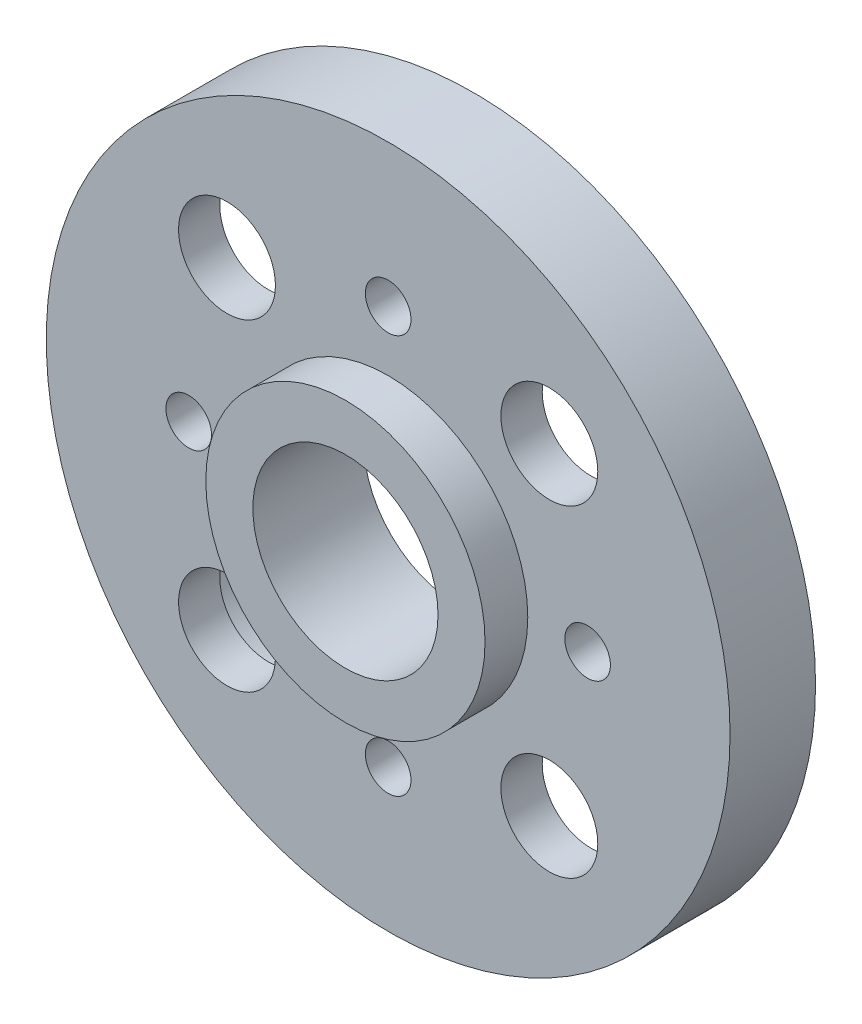
ISO-10303-21;
HEADER;
FILE_DESCRIPTION(('STEP AP214'),'2;1');
FILE_NAME('part.step','',(''),(''),'','','');
FILE_SCHEMA(('AUTOMOTIVE_DESIGN { 1 0 10303 214 1 1 1 1 }'));
ENDSEC;
DATA;
#1=APPLICATION_CONTEXT('core data for automotive mechanical design processes');
#2=APPLICATION_PROTOCOL_DEFINITION('international standard','automotive_design',2000,#1);
#3=PRODUCT_CONTEXT('',#1,'mechanical');
#4=PRODUCT('Part','Part','',(#3));
#5=PRODUCT_RELATED_PRODUCT_CATEGORY('part','',(#4));
#6=PRODUCT_DEFINITION_FORMATION('','',#4);
#7=PRODUCT_DEFINITION_CONTEXT('part definition',#1,'design');
#8=PRODUCT_DEFINITION('design','',#6,#7);
#9=PRODUCT_DEFINITION_SHAPE('','',#8);
#10=(LENGTH_UNIT() NAMED_UNIT(*) SI_UNIT(.MILLI.,.METRE.));
#11=(NAMED_UNIT(*) PLANE_ANGLE_UNIT() SI_UNIT($,.RADIAN.));
#12=(NAMED_UNIT(*) SI_UNIT($,.STERADIAN.) SOLID_ANGLE_UNIT());
#13=UNCERTAINTY_MEASURE_WITH_UNIT(LENGTH_MEASURE(1.E-05),#10,'distance_accuracy_value','');
#14=(GEOMETRIC_REPRESENTATION_CONTEXT(3) GLOBAL_UNCERTAINTY_ASSIGNED_CONTEXT((#13)) GLOBAL_UNIT_ASSIGNED_CONTEXT((#10,
#11,#12)) REPRESENTATION_CONTEXT('',''));
#15=CARTESIAN_POINT('',(0.,0.,0.));
#16=DIRECTION('',(0.,0.,1.));
#17=DIRECTION('',(1.,0.,0.));
#18=AXIS2_PLACEMENT_3D('',#15,#16,#17);
#19=CARTESIAN_POINT('',(0.,0.,0.));
#20=DIRECTION('',(0.,0.,1.));
#21=DIRECTION('',(1.,0.,0.));
#22=AXIS2_PLACEMENT_3D('',#19,#20,#21);
#23=PLANE('',#22);
#24=CARTESIAN_POINT('',(0.,0.,0.));
#25=DIRECTION('',(0.,0.,1.));
#26=DIRECTION('',(1.,0.,0.));
#27=AXIS2_PLACEMENT_3D('',#24,#25,#26);
#28=CIRCLE('',#27,12.);
#29=CARTESIAN_POINT('',(12.,0.,0.));
#30=VERTEX_POINT('',#29);
#31=EDGE_CURVE('E168',#30,#30,#28,.T.);
#32=ORIENTED_EDGE('',*,*,#31,.F.);
#33=EDGE_LOOP('',(#32));
#34=FACE_BOUND('',#33,.T.);
#35=CARTESIAN_POINT('',(5.65685424949238,5.65685424949238,0.));
#36=DIRECTION('',(0.,0.,-1.));
#37=DIRECTION('',(-1.,0.,0.));
#38=AXIS2_PLACEMENT_3D('',#35,#36,#37);
#39=CIRCLE('',#38,3.15);
#40=CARTESIAN_POINT('',(4.97507668163147,8.73218827166975,0.));
#41=VERTEX_POINT('',#40);
#42=CARTESIAN_POINT('',(8.73218827166975,4.97507668163147,0.));
#43=VERTEX_POINT('',#42);
#44=EDGE_CURVE('E134',#41,#43,#39,.T.);
#45=ORIENTED_EDGE('',*,*,#44,.F.);
#46=CARTESIAN_POINT('',(0.,0.,0.));
#47=DIRECTION('',(0.,0.,1.));
#48=DIRECTION('',(1.,0.,0.));
#49=AXIS2_PLACEMENT_3D('',#46,#47,#48);
#50=CIRCLE('',#49,10.05);
#51=CARTESIAN_POINT('',(-4.97507668163147,8.73218827166975,0.));
#52=VERTEX_POINT('',#51);
#53=EDGE_CURVE('E138',#41,#52,#50,.T.);
#54=ORIENTED_EDGE('',*,*,#53,.T.);
#55=CARTESIAN_POINT('',(-5.65685424949238,5.65685424949238,0.));
#56=DIRECTION('',(0.,0.,-1.));
#57=DIRECTION('',(-1.,0.,0.));
#58=AXIS2_PLACEMENT_3D('',#55,#56,#57);
#59=CIRCLE('',#58,3.15);
#60=CARTESIAN_POINT('',(-8.73218827166975,4.97507668163147,0.));
#61=VERTEX_POINT('',#60);
#62=EDGE_CURVE('E186',#61,#52,#59,.T.);
#63=ORIENTED_EDGE('',*,*,#62,.F.);
#64=CARTESIAN_POINT('',(-8.73218827166975,-4.97507668163147,0.));
#65=VERTEX_POINT('',#64);
#66=EDGE_CURVE('E207',#61,#65,#50,.T.);
#67=ORIENTED_EDGE('',*,*,#66,.T.);
#68=CARTESIAN_POINT('',(-5.65685424949238,-5.65685424949238,0.));
#69=DIRECTION('',(0.,0.,-1.));
#70=DIRECTION('',(-1.,0.,0.));
#71=AXIS2_PLACEMENT_3D('',#68,#69,#70);
#72=CIRCLE('',#71,3.15);
#73=CARTESIAN_POINT('',(-4.97507668163147,-8.73218827166975,0.));
#74=VERTEX_POINT('',#73);
#75=EDGE_CURVE('E193',#74,#65,#72,.T.);
#76=ORIENTED_EDGE('',*,*,#75,.F.);
#77=CARTESIAN_POINT('',(4.97507668163147,-8.73218827166975,0.));
#78=VERTEX_POINT('',#77);
#79=EDGE_CURVE('E139',#74,#78,#50,.T.);
#80=ORIENTED_EDGE('',*,*,#79,.T.);
#81=CARTESIAN_POINT('',(5.65685424949238,-5.65685424949238,0.));
#82=DIRECTION('',(0.,0.,-1.));
#83=DIRECTION('',(-1.,0.,0.));
#84=AXIS2_PLACEMENT_3D('',#81,#82,#83);
#85=CIRCLE('',#84,3.15);
#86=CARTESIAN_POINT('',(8.73218827166975,-4.97507668163147,0.));
#87=VERTEX_POINT('',#86);
#88=EDGE_CURVE('E133',#87,#78,#85,.T.);
#89=ORIENTED_EDGE('',*,*,#88,.F.);
#90=EDGE_CURVE('E116',#87,#43,#50,.T.);
#91=ORIENTED_EDGE('',*,*,#90,.T.);
#92=EDGE_LOOP('',(#45,#54,#63,#67,#76,#80,#89,#91));
#93=FACE_BOUND('',#92,.T.);
#94=ADVANCED_FACE('F51',(#34,#93),#23,.F.);
#95=CARTESIAN_POINT('',(5.65685424949238,5.65685424949238,0.));
#96=DIRECTION('',(0.,0.,-1.));
#97=DIRECTION('',(-1.,0.,0.));
#98=AXIS2_PLACEMENT_3D('',#95,#96,#97);
#99=CYLINDRICAL_SURFACE('',#98,3.15);
#100=CARTESIAN_POINT('',(5.65685424949238,5.65685424949238,1.55));
#101=DIRECTION('',(0.,0.,-1.));
#102=DIRECTION('',(-1.,0.,0.));
#103=AXIS2_PLACEMENT_3D('',#100,#101,#102);
#104=CIRCLE('',#103,3.15);
#105=CARTESIAN_POINT('',(2.50685424949238,5.65685424949238,1.55));
#106=VERTEX_POINT('',#105);
#107=EDGE_CURVE('E145',#106,#106,#104,.T.);
#108=ORIENTED_EDGE('',*,*,#107,.F.);
#109=EDGE_LOOP('',(#108));
#110=FACE_BOUND('',#109,.T.);
#111=DIRECTION('',(0.,0.,-1.));
#112=VECTOR('',#111,1.);
#113=CARTESIAN_POINT('',(4.97507668163147,8.73218827166975,0.3));
#114=LINE('',#113,#112);
#115=CARTESIAN_POINT('',(4.97507668163147,8.73218827166975,0.6));
#116=VERTEX_POINT('',#115);
#117=EDGE_CURVE('E123',#41,#116,#114,.F.);
#118=ORIENTED_EDGE('',*,*,#117,.F.);
#119=ORIENTED_EDGE('',*,*,#44,.T.);
#120=DIRECTION('',(0.,0.,-1.));
#121=VECTOR('',#120,1.);
#122=CARTESIAN_POINT('',(8.73218827166975,4.97507668163147,0.3));
#123=LINE('',#122,#121);
#124=CARTESIAN_POINT('',(8.73218827166975,4.97507668163147,0.6));
#125=VERTEX_POINT('',#124);
#126=EDGE_CURVE('E117',#125,#43,#123,.T.);
#127=ORIENTED_EDGE('',*,*,#126,.F.);
#128=CARTESIAN_POINT('',(5.65685424949238,5.65685424949238,0.6));
#129=DIRECTION('',(0.,0.,1.));
#130=DIRECTION('',(1.,0.,0.));
#131=AXIS2_PLACEMENT_3D('',#128,#129,#130);
#132=CIRCLE('',#131,3.15);
#133=EDGE_CURVE('E382',#125,#116,#132,.F.);
#134=ORIENTED_EDGE('',*,*,#133,.T.);
#135=EDGE_LOOP('',(#118,#119,#127,#134));
#136=FACE_BOUND('',#135,.T.);
#137=ADVANCED_FACE('F142',(#110,#136),#99,.F.);
#138=CARTESIAN_POINT('',(-5.65685424949238,5.65685424949238,0.));
#139=DIRECTION('',(0.,0.,-1.));
#140=DIRECTION('',(-1.,0.,0.));
#141=AXIS2_PLACEMENT_3D('',#138,#139,#140);
#142=CYLINDRICAL_SURFACE('',#141,3.15);
#143=CARTESIAN_POINT('',(-5.65685424949238,5.65685424949238,1.55));
#144=DIRECTION('',(0.,0.,-1.));
#145=DIRECTION('',(-1.,0.,0.));
#146=AXIS2_PLACEMENT_3D('',#143,#144,#145);
#147=CIRCLE('',#146,3.15);
#148=CARTESIAN_POINT('',(-8.80685424949238,5.65685424949238,1.55));
#149=VERTEX_POINT('',#148);
#150=EDGE_CURVE('E231',#149,#149,#147,.T.);
#151=ORIENTED_EDGE('',*,*,#150,.F.);
#152=EDGE_LOOP('',(#151));
#153=FACE_BOUND('',#152,.T.);
#154=DIRECTION('',(0.,0.,-1.));
#155=VECTOR('',#154,1.);
#156=CARTESIAN_POINT('',(-8.73218827166975,4.97507668163147,0.3));
#157=LINE('',#156,#155);
#158=CARTESIAN_POINT('',(-8.73218827166975,4.97507668163147,0.6));
#159=VERTEX_POINT('',#158);
#160=EDGE_CURVE('E127',#61,#159,#157,.F.);
#161=ORIENTED_EDGE('',*,*,#160,.F.);
#162=ORIENTED_EDGE('',*,*,#62,.T.);
#163=DIRECTION('',(0.,0.,-1.));
#164=VECTOR('',#163,1.);
#165=CARTESIAN_POINT('',(-4.97507668163147,8.73218827166975,0.3));
#166=LINE('',#165,#164);
#167=CARTESIAN_POINT('',(-4.97507668163147,8.73218827166975,0.6));
#168=VERTEX_POINT('',#167);
#169=EDGE_CURVE('E397',#168,#52,#166,.T.);
#170=ORIENTED_EDGE('',*,*,#169,.F.);
#171=CARTESIAN_POINT('',(-5.65685424949238,5.65685424949238,0.6));
#172=DIRECTION('',(0.,0.,1.));
#173=DIRECTION('',(1.,0.,0.));
#174=AXIS2_PLACEMENT_3D('',#171,#172,#173);
#175=CIRCLE('',#174,3.15);
#176=EDGE_CURVE('E377',#168,#159,#175,.F.);
#177=ORIENTED_EDGE('',*,*,#176,.T.);
#178=EDGE_LOOP('',(#161,#162,#170,#177));
#179=FACE_BOUND('',#178,.T.);
#180=ADVANCED_FACE('F262',(#153,#179),#142,.F.);
#181=CARTESIAN_POINT('',(-5.65685424949238,-5.65685424949238,0.));
#182=DIRECTION('',(0.,0.,-1.));
#183=DIRECTION('',(-1.,0.,0.));
#184=AXIS2_PLACEMENT_3D('',#181,#182,#183);
#185=CYLINDRICAL_SURFACE('',#184,3.15);
#186=CARTESIAN_POINT('',(-5.65685424949238,-5.65685424949238,1.55));
#187=DIRECTION('',(0.,0.,-1.));
#188=DIRECTION('',(-1.,0.,0.));
#189=AXIS2_PLACEMENT_3D('',#186,#187,#188);
#190=CIRCLE('',#189,3.15);
#191=CARTESIAN_POINT('',(-8.80685424949238,-5.65685424949238,1.55));
#192=VERTEX_POINT('',#191);
#193=EDGE_CURVE('E223',#192,#192,#190,.T.);
#194=ORIENTED_EDGE('',*,*,#193,.F.);
#195=EDGE_LOOP('',(#194));
#196=FACE_BOUND('',#195,.T.);
#197=DIRECTION('',(0.,0.,-1.));
#198=VECTOR('',#197,1.);
#199=CARTESIAN_POINT('',(-4.97507668163147,-8.73218827166975,0.3));
#200=LINE('',#199,#198);
#201=CARTESIAN_POINT('',(-4.97507668163147,-8.73218827166975,0.6));
#202=VERTEX_POINT('',#201);
#203=EDGE_CURVE('E395',#74,#202,#200,.F.);
#204=ORIENTED_EDGE('',*,*,#203,.F.);
#205=ORIENTED_EDGE('',*,*,#75,.T.);
#206=DIRECTION('',(0.,0.,-1.));
#207=VECTOR('',#206,1.);
#208=CARTESIAN_POINT('',(-8.73218827166975,-4.97507668163147,0.3));
#209=LINE('',#208,#207);
#210=CARTESIAN_POINT('',(-8.73218827166975,-4.97507668163147,0.6));
#211=VERTEX_POINT('',#210);
#212=EDGE_CURVE('E388',#211,#65,#209,.T.);
#213=ORIENTED_EDGE('',*,*,#212,.F.);
#214=CARTESIAN_POINT('',(-5.65685424949238,-5.65685424949238,0.6));
#215=DIRECTION('',(0.,0.,1.));
#216=DIRECTION('',(1.,0.,0.));
#217=AXIS2_PLACEMENT_3D('',#214,#215,#216);
#218=CIRCLE('',#217,3.15);
#219=EDGE_CURVE('E374',#211,#202,#218,.F.);
#220=ORIENTED_EDGE('',*,*,#219,.T.);
#221=EDGE_LOOP('',(#204,#205,#213,#220));
#222=FACE_BOUND('',#221,.T.);
#223=ADVANCED_FACE('F417',(#196,#222),#185,.F.);
#224=CARTESIAN_POINT('',(5.65685424949238,-5.65685424949238,0.));
#225=DIRECTION('',(0.,0.,-1.));
#226=DIRECTION('',(-1.,0.,0.));
#227=AXIS2_PLACEMENT_3D('',#224,#225,#226);
#228=CYLINDRICAL_SURFACE('',#227,3.15);
#229=CARTESIAN_POINT('',(5.65685424949238,-5.65685424949238,1.55));
#230=DIRECTION('',(0.,0.,-1.));
#231=DIRECTION('',(-1.,0.,0.));
#232=AXIS2_PLACEMENT_3D('',#229,#230,#231);
#233=CIRCLE('',#232,3.15);
#234=CARTESIAN_POINT('',(2.50685424949238,-5.65685424949238,1.55));
#235=VERTEX_POINT('',#234);
#236=EDGE_CURVE('E215',#235,#235,#233,.T.);
#237=ORIENTED_EDGE('',*,*,#236,.F.);
#238=EDGE_LOOP('',(#237));
#239=FACE_BOUND('',#238,.T.);
#240=DIRECTION('',(0.,0.,-1.));
#241=VECTOR('',#240,1.);
#242=CARTESIAN_POINT('',(8.73218827166975,-4.97507668163147,0.3));
#243=LINE('',#242,#241);
#244=CARTESIAN_POINT('',(8.73218827166975,-4.97507668163147,0.6));
#245=VERTEX_POINT('',#244);
#246=EDGE_CURVE('E11',#87,#245,#243,.F.);
#247=ORIENTED_EDGE('',*,*,#246,.F.);
#248=ORIENTED_EDGE('',*,*,#88,.T.);
#249=DIRECTION('',(0.,0.,-1.));
#250=VECTOR('',#249,1.);
#251=CARTESIAN_POINT('',(4.97507668163147,-8.73218827166975,0.3));
#252=LINE('',#251,#250);
#253=CARTESIAN_POINT('',(4.97507668163147,-8.73218827166975,0.6));
#254=VERTEX_POINT('',#253);
#255=EDGE_CURVE('E62',#254,#78,#252,.T.);
#256=ORIENTED_EDGE('',*,*,#255,.F.);
#257=CARTESIAN_POINT('',(5.65685424949238,-5.65685424949238,0.6));
#258=DIRECTION('',(0.,0.,1.));
#259=DIRECTION('',(1.,0.,0.));
#260=AXIS2_PLACEMENT_3D('',#257,#258,#259);
#261=CIRCLE('',#260,3.15);
#262=EDGE_CURVE('E75',#254,#245,#261,.F.);
#263=ORIENTED_EDGE('',*,*,#262,.T.);
#264=EDGE_LOOP('',(#247,#248,#256,#263));
#265=FACE_BOUND('',#264,.T.);
#266=ADVANCED_FACE('F209',(#239,#265),#228,.F.);
#267=CARTESIAN_POINT('',(0.,0.,3.));
#268=DIRECTION('',(0.,0.,1.));
#269=DIRECTION('',(1.,0.,0.));
#270=AXIS2_PLACEMENT_3D('',#267,#268,#269);
#271=PLANE('',#270);
#272=CARTESIAN_POINT('',(0.,-7.,3.));
#273=DIRECTION('',(0.,0.,1.));
#274=DIRECTION('',(1.,0.,0.));
#275=AXIS2_PLACEMENT_3D('',#272,#273,#274);
#276=CIRCLE('',#275,0.799999999999993);
#277=CARTESIAN_POINT('',(0.799999999999993,-7.,3.));
#278=VERTEX_POINT('',#277);
#279=EDGE_CURVE('E336',#278,#278,#276,.T.);
#280=ORIENTED_EDGE('',*,*,#279,.F.);
#281=EDGE_LOOP('',(#280));
#282=FACE_BOUND('',#281,.T.);
#283=CARTESIAN_POINT('',(-7.,0.,3.));
#284=DIRECTION('',(0.,0.,1.));
#285=DIRECTION('',(1.,0.,0.));
#286=AXIS2_PLACEMENT_3D('',#283,#284,#285);
#287=CIRCLE('',#286,0.799999999999993);
#288=CARTESIAN_POINT('',(-6.20000000000001,0.,3.));
#289=VERTEX_POINT('',#288);
#290=EDGE_CURVE('E355',#289,#289,#287,.T.);
#291=ORIENTED_EDGE('',*,*,#290,.F.);
#292=EDGE_LOOP('',(#291));
#293=FACE_BOUND('',#292,.T.);
#294=CARTESIAN_POINT('',(0.,7.,3.));
#295=DIRECTION('',(0.,0.,1.));
#296=DIRECTION('',(1.,0.,0.));
#297=AXIS2_PLACEMENT_3D('',#294,#295,#296);
#298=CIRCLE('',#297,0.799999999999993);
#299=CARTESIAN_POINT('',(0.799999999999993,7.,3.));
#300=VERTEX_POINT('',#299);
#301=EDGE_CURVE('E363',#300,#300,#298,.T.);
#302=ORIENTED_EDGE('',*,*,#301,.F.);
#303=EDGE_LOOP('',(#302));
#304=FACE_BOUND('',#303,.T.);
#305=CARTESIAN_POINT('',(7.,0.,3.));
#306=DIRECTION('',(0.,0.,1.));
#307=DIRECTION('',(1.,0.,0.));
#308=AXIS2_PLACEMENT_3D('',#305,#306,#307);
#309=CIRCLE('',#308,0.799999999999993);
#310=CARTESIAN_POINT('',(7.79999999999999,0.,3.));
#311=VERTEX_POINT('',#310);
#312=EDGE_CURVE('E140',#311,#311,#309,.T.);
#313=ORIENTED_EDGE('',*,*,#312,.F.);
#314=EDGE_LOOP('',(#313));
#315=FACE_BOUND('',#314,.T.);
#316=CARTESIAN_POINT('',(5.65685424949238,-5.65685424949238,3.));
#317=DIRECTION('',(0.,0.,1.));
#318=DIRECTION('',(1.,0.,0.));
#319=AXIS2_PLACEMENT_3D('',#316,#317,#318);
#320=CIRCLE('',#319,1.7);
#321=CARTESIAN_POINT('',(7.35685424949238,-5.65685424949238,3.));
#322=VERTEX_POINT('',#321);
#323=EDGE_CURVE('E192',#322,#322,#320,.T.);
#324=ORIENTED_EDGE('',*,*,#323,.F.);
#325=EDGE_LOOP('',(#324));
#326=FACE_BOUND('',#325,.T.);
#327=CARTESIAN_POINT('',(-5.65685424949238,-5.65685424949238,3.));
#328=DIRECTION('',(0.,0.,1.));
#329=DIRECTION('',(1.,0.,0.));
#330=AXIS2_PLACEMENT_3D('',#327,#328,#329);
#331=CIRCLE('',#330,1.7);
#332=CARTESIAN_POINT('',(-3.95685424949238,-5.65685424949238,3.));
#333=VERTEX_POINT('',#332);
#334=EDGE_CURVE('E183',#333,#333,#331,.T.);
#335=ORIENTED_EDGE('',*,*,#334,.F.);
#336=EDGE_LOOP('',(#335));
#337=FACE_BOUND('',#336,.T.);
#338=CARTESIAN_POINT('',(-5.65685424949238,5.65685424949238,3.));
#339=DIRECTION('',(0.,0.,1.));
#340=DIRECTION('',(1.,0.,0.));
#341=AXIS2_PLACEMENT_3D('',#338,#339,#340);
#342=CIRCLE('',#341,1.7);
#343=CARTESIAN_POINT('',(-3.95685424949238,5.65685424949238,3.));
#344=VERTEX_POINT('',#343);
#345=EDGE_CURVE('E144',#344,#344,#342,.T.);
#346=ORIENTED_EDGE('',*,*,#345,.F.);
#347=EDGE_LOOP('',(#346));
#348=FACE_BOUND('',#347,.T.);
#349=CARTESIAN_POINT('',(5.65685424949238,5.65685424949238,3.));
#350=DIRECTION('',(0.,0.,1.));
#351=DIRECTION('',(1.,0.,0.));
#352=AXIS2_PLACEMENT_3D('',#349,#350,#351);
#353=CIRCLE('',#352,1.7);
#354=CARTESIAN_POINT('',(7.35685424949238,5.65685424949238,3.));
#355=VERTEX_POINT('',#354);
#356=EDGE_CURVE('E161',#355,#355,#353,.T.);
#357=ORIENTED_EDGE('',*,*,#356,.F.);
#358=EDGE_LOOP('',(#357));
#359=FACE_BOUND('',#358,.T.);
#360=CARTESIAN_POINT('',(0.,0.,3.));
#361=DIRECTION('',(0.,0.,1.));
#362=DIRECTION('',(1.,0.,0.));
#363=AXIS2_PLACEMENT_3D('',#360,#361,#362);
#364=CIRCLE('',#363,4.9);
#365=CARTESIAN_POINT('',(4.9,0.,3.));
#366=VERTEX_POINT('',#365);
#367=EDGE_CURVE('E172',#366,#366,#364,.T.);
#368=ORIENTED_EDGE('',*,*,#367,.F.);
#369=EDGE_LOOP('',(#368));
#370=FACE_BOUND('',#369,.T.);
#371=CARTESIAN_POINT('',(0.,0.,3.));
#372=DIRECTION('',(0.,0.,1.));
#373=DIRECTION('',(1.,0.,0.));
#374=AXIS2_PLACEMENT_3D('',#371,#372,#373);
#375=CIRCLE('',#374,12.);
#376=CARTESIAN_POINT('',(12.,0.,3.));
#377=VERTEX_POINT('',#376);
#378=EDGE_CURVE('E173',#377,#377,#375,.T.);
#379=ORIENTED_EDGE('',*,*,#378,.T.);
#380=EDGE_LOOP('',(#379));
#381=FACE_BOUND('',#380,.T.);
#382=ADVANCED_FACE('F275',(#282,#293,#304,#315,#326,#337,#348,#359,#370,#381),#271,.T.);
#383=CARTESIAN_POINT('',(0.,0.,3.));
#384=DIRECTION('',(0.,0.,-1.));
#385=DIRECTION('',(-1.,0.,0.));
#386=AXIS2_PLACEMENT_3D('',#383,#384,#385);
#387=CYLINDRICAL_SURFACE('',#386,12.);
#388=ORIENTED_EDGE('',*,*,#378,.F.);
#389=EDGE_LOOP('',(#388));
#390=FACE_BOUND('',#389,.T.);
#391=ORIENTED_EDGE('',*,*,#31,.T.);
#392=EDGE_LOOP('',(#391));
#393=FACE_BOUND('',#392,.T.);
#394=ADVANCED_FACE('F53',(#390,#393),#387,.T.);
#395=CARTESIAN_POINT('',(0.,0.,3.));
#396=DIRECTION('',(0.,0.,-1.));
#397=DIRECTION('',(-1.,0.,0.));
#398=AXIS2_PLACEMENT_3D('',#395,#396,#397);
#399=CYLINDRICAL_SURFACE('',#398,3.25);
#400=CARTESIAN_POINT('',(0.,0.,0.6));
#401=DIRECTION('',(0.,0.,1.));
#402=DIRECTION('',(1.,0.,0.));
#403=AXIS2_PLACEMENT_3D('',#400,#401,#402);
#404=CIRCLE('',#403,3.25);
#405=CARTESIAN_POINT('',(3.25,0.,0.6));
#406=VERTEX_POINT('',#405);
#407=EDGE_CURVE('E387',#406,#406,#404,.T.);
#408=ORIENTED_EDGE('',*,*,#407,.F.);
#409=EDGE_LOOP('',(#408));
#410=FACE_BOUND('',#409,.T.);
#411=CARTESIAN_POINT('',(0.,0.,4.5));
#412=DIRECTION('',(0.,0.,1.));
#413=DIRECTION('',(1.,0.,0.));
#414=AXIS2_PLACEMENT_3D('',#411,#412,#413);
#415=CIRCLE('',#414,3.25);
#416=CARTESIAN_POINT('',(3.25,0.,4.5));
#417=VERTEX_POINT('',#416);
#418=EDGE_CURVE('E165',#417,#417,#415,.T.);
#419=ORIENTED_EDGE('',*,*,#418,.T.);
#420=EDGE_LOOP('',(#419));
#421=FACE_BOUND('',#420,.T.);
#422=ADVANCED_FACE('F279',(#410,#421),#399,.F.);
#423=CARTESIAN_POINT('',(0.,0.,4.5));
#424=DIRECTION('',(0.,0.,1.));
#425=DIRECTION('',(1.,0.,0.));
#426=AXIS2_PLACEMENT_3D('',#423,#424,#425);
#427=PLANE('',#426);
#428=CARTESIAN_POINT('',(0.,0.,4.5));
#429=DIRECTION('',(0.,0.,1.));
#430=DIRECTION('',(1.,0.,0.));
#431=AXIS2_PLACEMENT_3D('',#428,#429,#430);
#432=CIRCLE('',#431,4.9);
#433=CARTESIAN_POINT('',(4.9,0.,4.5));
#434=VERTEX_POINT('',#433);
#435=EDGE_CURVE('E167',#434,#434,#432,.T.);
#436=ORIENTED_EDGE('',*,*,#435,.T.);
#437=EDGE_LOOP('',(#436));
#438=FACE_BOUND('',#437,.T.);
#439=ORIENTED_EDGE('',*,*,#418,.F.);
#440=EDGE_LOOP('',(#439));
#441=FACE_BOUND('',#440,.T.);
#442=ADVANCED_FACE('F284',(#438,#441),#427,.T.);
#443=CARTESIAN_POINT('',(0.,0.,4.5));
#444=DIRECTION('',(0.,0.,-1.));
#445=DIRECTION('',(-1.,0.,0.));
#446=AXIS2_PLACEMENT_3D('',#443,#444,#445);
#447=CYLINDRICAL_SURFACE('',#446,4.9);
#448=ORIENTED_EDGE('',*,*,#435,.F.);
#449=EDGE_LOOP('',(#448));
#450=FACE_BOUND('',#449,.T.);
#451=ORIENTED_EDGE('',*,*,#367,.T.);
#452=EDGE_LOOP('',(#451));
#453=FACE_BOUND('',#452,.T.);
#454=ADVANCED_FACE('F283',(#450,#453),#447,.T.);
#455=CARTESIAN_POINT('',(5.65685424949238,5.65685424949238,0.));
#456=DIRECTION('',(0.,0.,-1.));
#457=DIRECTION('',(-1.,0.,0.));
#458=AXIS2_PLACEMENT_3D('',#455,#456,#457);
#459=CYLINDRICAL_SURFACE('',#458,1.7);
#460=ORIENTED_EDGE('',*,*,#356,.T.);
#461=EDGE_LOOP('',(#460));
#462=FACE_BOUND('',#461,.T.);
#463=CARTESIAN_POINT('',(5.65685424949238,5.65685424949238,1.55));
#464=DIRECTION('',(0.,0.,-1.));
#465=DIRECTION('',(-1.,0.,0.));
#466=AXIS2_PLACEMENT_3D('',#463,#464,#465);
#467=CIRCLE('',#466,1.7);
#468=CARTESIAN_POINT('',(3.95685424949238,5.65685424949238,1.55));
#469=VERTEX_POINT('',#468);
#470=EDGE_CURVE('E147',#469,#469,#467,.T.);
#471=ORIENTED_EDGE('',*,*,#470,.T.);
#472=EDGE_LOOP('',(#471));
#473=FACE_BOUND('',#472,.T.);
#474=ADVANCED_FACE('F286',(#462,#473),#459,.F.);
#475=CARTESIAN_POINT('',(7.35685424949238,5.65685424949238,1.55));
#476=DIRECTION('',(0.,0.,1.));
#477=DIRECTION('',(1.,0.,0.));
#478=AXIS2_PLACEMENT_3D('',#475,#476,#477);
#479=PLANE('',#478);
#480=ORIENTED_EDGE('',*,*,#470,.F.);
#481=EDGE_LOOP('',(#480));
#482=FACE_BOUND('',#481,.T.);
#483=ORIENTED_EDGE('',*,*,#107,.T.);
#484=EDGE_LOOP('',(#483));
#485=FACE_BOUND('',#484,.T.);
#486=ADVANCED_FACE('F254',(#482,#485),#479,.F.);
#487=CARTESIAN_POINT('',(-5.65685424949238,5.65685424949238,0.));
#488=DIRECTION('',(0.,0.,-1.));
#489=DIRECTION('',(-1.,0.,0.));
#490=AXIS2_PLACEMENT_3D('',#487,#488,#489);
#491=CYLINDRICAL_SURFACE('',#490,1.7);
#492=ORIENTED_EDGE('',*,*,#345,.T.);
#493=EDGE_LOOP('',(#492));
#494=FACE_BOUND('',#493,.T.);
#495=CARTESIAN_POINT('',(-5.65685424949238,5.65685424949238,1.55));
#496=DIRECTION('',(0.,0.,-1.));
#497=DIRECTION('',(-1.,0.,0.));
#498=AXIS2_PLACEMENT_3D('',#495,#496,#497);
#499=CIRCLE('',#498,1.7);
#500=CARTESIAN_POINT('',(-7.35685424949238,5.65685424949238,1.55));
#501=VERTEX_POINT('',#500);
#502=EDGE_CURVE('E153',#501,#501,#499,.T.);
#503=ORIENTED_EDGE('',*,*,#502,.T.);
#504=EDGE_LOOP('',(#503));
#505=FACE_BOUND('',#504,.T.);
#506=ADVANCED_FACE('F245',(#494,#505),#491,.F.);
#507=CARTESIAN_POINT('',(-3.95685424949238,5.65685424949238,1.55));
#508=DIRECTION('',(0.,0.,1.));
#509=DIRECTION('',(1.,0.,0.));
#510=AXIS2_PLACEMENT_3D('',#507,#508,#509);
#511=PLANE('',#510);
#512=ORIENTED_EDGE('',*,*,#502,.F.);
#513=EDGE_LOOP('',(#512));
#514=FACE_BOUND('',#513,.T.);
#515=ORIENTED_EDGE('',*,*,#150,.T.);
#516=EDGE_LOOP('',(#515));
#517=FACE_BOUND('',#516,.T.);
#518=ADVANCED_FACE('F243',(#514,#517),#511,.F.);
#519=CARTESIAN_POINT('',(-5.65685424949238,-5.65685424949238,0.));
#520=DIRECTION('',(0.,0.,-1.));
#521=DIRECTION('',(-1.,0.,0.));
#522=AXIS2_PLACEMENT_3D('',#519,#520,#521);
#523=CYLINDRICAL_SURFACE('',#522,1.7);
#524=ORIENTED_EDGE('',*,*,#334,.T.);
#525=EDGE_LOOP('',(#524));
#526=FACE_BOUND('',#525,.T.);
#527=CARTESIAN_POINT('',(-5.65685424949238,-5.65685424949238,1.55));
#528=DIRECTION('',(0.,0.,-1.));
#529=DIRECTION('',(-1.,0.,0.));
#530=AXIS2_PLACEMENT_3D('',#527,#528,#529);
#531=CIRCLE('',#530,1.7);
#532=CARTESIAN_POINT('',(-7.35685424949238,-5.65685424949238,1.55));
#533=VERTEX_POINT('',#532);
#534=EDGE_CURVE('E188',#533,#533,#531,.T.);
#535=ORIENTED_EDGE('',*,*,#534,.T.);
#536=EDGE_LOOP('',(#535));
#537=FACE_BOUND('',#536,.T.);
#538=ADVANCED_FACE('F249',(#526,#537),#523,.F.);
#539=CARTESIAN_POINT('',(-3.95685424949238,-5.65685424949238,1.55));
#540=DIRECTION('',(0.,0.,1.));
#541=DIRECTION('',(1.,0.,0.));
#542=AXIS2_PLACEMENT_3D('',#539,#540,#541);
#543=PLANE('',#542);
#544=ORIENTED_EDGE('',*,*,#534,.F.);
#545=EDGE_LOOP('',(#544));
#546=FACE_BOUND('',#545,.T.);
#547=ORIENTED_EDGE('',*,*,#193,.T.);
#548=EDGE_LOOP('',(#547));
#549=FACE_BOUND('',#548,.T.);
#550=ADVANCED_FACE('F252',(#546,#549),#543,.F.);
#551=CARTESIAN_POINT('',(5.65685424949238,-5.65685424949238,0.));
#552=DIRECTION('',(0.,0.,-1.));
#553=DIRECTION('',(-1.,0.,0.));
#554=AXIS2_PLACEMENT_3D('',#551,#552,#553);
#555=CYLINDRICAL_SURFACE('',#554,1.7);
#556=ORIENTED_EDGE('',*,*,#323,.T.);
#557=EDGE_LOOP('',(#556));
#558=FACE_BOUND('',#557,.T.);
#559=CARTESIAN_POINT('',(5.65685424949238,-5.65685424949238,1.55));
#560=DIRECTION('',(0.,0.,-1.));
#561=DIRECTION('',(-1.,0.,0.));
#562=AXIS2_PLACEMENT_3D('',#559,#560,#561);
#563=CIRCLE('',#562,1.7);
#564=CARTESIAN_POINT('',(3.95685424949238,-5.65685424949238,1.55));
#565=VERTEX_POINT('',#564);
#566=EDGE_CURVE('E198',#565,#565,#563,.T.);
#567=ORIENTED_EDGE('',*,*,#566,.T.);
#568=EDGE_LOOP('',(#567));
#569=FACE_BOUND('',#568,.T.);
#570=ADVANCED_FACE('F310',(#558,#569),#555,.F.);
#571=CARTESIAN_POINT('',(7.35685424949238,-5.65685424949238,1.55));
#572=DIRECTION('',(0.,0.,1.));
#573=DIRECTION('',(1.,0.,0.));
#574=AXIS2_PLACEMENT_3D('',#571,#572,#573);
#575=PLANE('',#574);
#576=ORIENTED_EDGE('',*,*,#566,.F.);
#577=EDGE_LOOP('',(#576));
#578=FACE_BOUND('',#577,.T.);
#579=ORIENTED_EDGE('',*,*,#236,.T.);
#580=EDGE_LOOP('',(#579));
#581=FACE_BOUND('',#580,.T.);
#582=ADVANCED_FACE('F315',(#578,#581),#575,.F.);
#583=CARTESIAN_POINT('',(0.,0.,0.6));
#584=DIRECTION('',(0.,0.,-1.));
#585=DIRECTION('',(-1.,0.,0.));
#586=AXIS2_PLACEMENT_3D('',#583,#584,#585);
#587=CYLINDRICAL_SURFACE('',#586,10.05);
#588=ORIENTED_EDGE('',*,*,#117,.T.);
#589=CARTESIAN_POINT('',(0.,0.,0.6));
#590=DIRECTION('',(0.,0.,1.));
#591=DIRECTION('',(1.,0.,0.));
#592=AXIS2_PLACEMENT_3D('',#589,#590,#591);
#593=CIRCLE('',#592,10.05);
#594=EDGE_CURVE('E373',#116,#168,#593,.T.);
#595=ORIENTED_EDGE('',*,*,#594,.T.);
#596=ORIENTED_EDGE('',*,*,#169,.T.);
#597=ORIENTED_EDGE('',*,*,#53,.F.);
#598=EDGE_LOOP('',(#588,#595,#596,#597));
#599=FACE_BOUND('',#598,.T.);
#600=ADVANCED_FACE('F316',(#599),#587,.F.);
#601=ORIENTED_EDGE('',*,*,#126,.T.);
#602=ORIENTED_EDGE('',*,*,#90,.F.);
#603=ORIENTED_EDGE('',*,*,#246,.T.);
#604=EDGE_CURVE('E70',#245,#125,#593,.T.);
#605=ORIENTED_EDGE('',*,*,#604,.T.);
#606=EDGE_LOOP('',(#601,#602,#603,#605));
#607=FACE_BOUND('',#606,.T.);
#608=ADVANCED_FACE('F120',(#607),#587,.F.);
#609=ORIENTED_EDGE('',*,*,#160,.T.);
#610=EDGE_CURVE('E403',#159,#211,#593,.T.);
#611=ORIENTED_EDGE('',*,*,#610,.T.);
#612=ORIENTED_EDGE('',*,*,#212,.T.);
#613=ORIENTED_EDGE('',*,*,#66,.F.);
#614=EDGE_LOOP('',(#609,#611,#612,#613));
#615=FACE_BOUND('',#614,.T.);
#616=ADVANCED_FACE('F404',(#615),#587,.F.);
#617=ORIENTED_EDGE('',*,*,#203,.T.);
#618=EDGE_CURVE('E201',#202,#254,#593,.T.);
#619=ORIENTED_EDGE('',*,*,#618,.T.);
#620=ORIENTED_EDGE('',*,*,#255,.T.);
#621=ORIENTED_EDGE('',*,*,#79,.F.);
#622=EDGE_LOOP('',(#617,#619,#620,#621));
#623=FACE_BOUND('',#622,.T.);
#624=ADVANCED_FACE('F203',(#623),#587,.F.);
#625=CARTESIAN_POINT('',(0.,0.,0.6));
#626=DIRECTION('',(0.,0.,1.));
#627=DIRECTION('',(1.,0.,0.));
#628=AXIS2_PLACEMENT_3D('',#625,#626,#627);
#629=PLANE('',#628);
#630=CARTESIAN_POINT('',(0.,-7.,0.599999999999999));
#631=DIRECTION('',(0.,0.,-1.));
#632=DIRECTION('',(-1.,0.,0.));
#633=AXIS2_PLACEMENT_3D('',#630,#631,#632);
#634=CIRCLE('',#633,0.799999999999988);
#635=CARTESIAN_POINT('',(-0.799999999999988,-7.,0.599999999999999));
#636=VERTEX_POINT('',#635);
#637=EDGE_CURVE('E344',#636,#636,#634,.T.);
#638=ORIENTED_EDGE('',*,*,#637,.F.);
#639=EDGE_LOOP('',(#638));
#640=FACE_BOUND('',#639,.T.);
#641=CARTESIAN_POINT('',(-7.,0.,0.599999999999999));
#642=DIRECTION('',(0.,0.,-1.));
#643=DIRECTION('',(-1.,0.,0.));
#644=AXIS2_PLACEMENT_3D('',#641,#642,#643);
#645=CIRCLE('',#644,0.799999999999988);
#646=CARTESIAN_POINT('',(-7.79999999999999,0.,0.599999999999999));
#647=VERTEX_POINT('',#646);
#648=EDGE_CURVE('E350',#647,#647,#645,.T.);
#649=ORIENTED_EDGE('',*,*,#648,.F.);
#650=EDGE_LOOP('',(#649));
#651=FACE_BOUND('',#650,.T.);
#652=CARTESIAN_POINT('',(0.,7.,0.599999999999999));
#653=DIRECTION('',(0.,0.,-1.));
#654=DIRECTION('',(-1.,0.,0.));
#655=AXIS2_PLACEMENT_3D('',#652,#653,#654);
#656=CIRCLE('',#655,0.799999999999988);
#657=CARTESIAN_POINT('',(-0.799999999999988,7.,0.599999999999999));
#658=VERTEX_POINT('',#657);
#659=EDGE_CURVE('E359',#658,#658,#656,.T.);
#660=ORIENTED_EDGE('',*,*,#659,.F.);
#661=EDGE_LOOP('',(#660));
#662=FACE_BOUND('',#661,.T.);
#663=CARTESIAN_POINT('',(7.,0.,0.599999999999999));
#664=DIRECTION('',(0.,0.,-1.));
#665=DIRECTION('',(-1.,0.,0.));
#666=AXIS2_PLACEMENT_3D('',#663,#664,#665);
#667=CIRCLE('',#666,0.799999999999988);
#668=CARTESIAN_POINT('',(6.20000000000001,0.,0.599999999999999));
#669=VERTEX_POINT('',#668);
#670=EDGE_CURVE('E364',#669,#669,#667,.T.);
#671=ORIENTED_EDGE('',*,*,#670,.F.);
#672=EDGE_LOOP('',(#671));
#673=FACE_BOUND('',#672,.T.);
#674=ORIENTED_EDGE('',*,*,#407,.T.);
#675=EDGE_LOOP('',(#674));
#676=FACE_BOUND('',#675,.T.);
#677=ORIENTED_EDGE('',*,*,#604,.F.);
#678=ORIENTED_EDGE('',*,*,#262,.F.);
#679=ORIENTED_EDGE('',*,*,#618,.F.);
#680=ORIENTED_EDGE('',*,*,#219,.F.);
#681=ORIENTED_EDGE('',*,*,#610,.F.);
#682=ORIENTED_EDGE('',*,*,#176,.F.);
#683=ORIENTED_EDGE('',*,*,#594,.F.);
#684=ORIENTED_EDGE('',*,*,#133,.F.);
#685=EDGE_LOOP('',(#677,#678,#679,#680,#681,#682,#683,#684));
#686=FACE_BOUND('',#685,.T.);
#687=ADVANCED_FACE('F317',(#640,#651,#662,#673,#676,#686),#629,.F.);
#688=CARTESIAN_POINT('',(7.,0.,0.6));
#689=DIRECTION('',(0.,0.,-1.));
#690=DIRECTION('',(-1.,0.,0.));
#691=AXIS2_PLACEMENT_3D('',#688,#689,#690);
#692=CYLINDRICAL_SURFACE('',#691,0.799999999999993);
#693=ORIENTED_EDGE('',*,*,#312,.T.);
#694=EDGE_LOOP('',(#693));
#695=FACE_BOUND('',#694,.T.);
#696=ORIENTED_EDGE('',*,*,#670,.T.);
#697=EDGE_LOOP('',(#696));
#698=FACE_BOUND('',#697,.T.);
#699=ADVANCED_FACE('F325',(#695,#698),#692,.F.);
#700=CARTESIAN_POINT('',(0.,7.,0.6));
#701=DIRECTION('',(0.,0.,-1.));
#702=DIRECTION('',(-1.,0.,0.));
#703=AXIS2_PLACEMENT_3D('',#700,#701,#702);
#704=CYLINDRICAL_SURFACE('',#703,0.799999999999993);
#705=ORIENTED_EDGE('',*,*,#301,.T.);
#706=EDGE_LOOP('',(#705));
#707=FACE_BOUND('',#706,.T.);
#708=ORIENTED_EDGE('',*,*,#659,.T.);
#709=EDGE_LOOP('',(#708));
#710=FACE_BOUND('',#709,.T.);
#711=ADVANCED_FACE('F324',(#707,#710),#704,.F.);
#712=CARTESIAN_POINT('',(-7.,0.,0.6));
#713=DIRECTION('',(0.,0.,-1.));
#714=DIRECTION('',(-1.,0.,0.));
#715=AXIS2_PLACEMENT_3D('',#712,#713,#714);
#716=CYLINDRICAL_SURFACE('',#715,0.799999999999993);
#717=ORIENTED_EDGE('',*,*,#290,.T.);
#718=EDGE_LOOP('',(#717));
#719=FACE_BOUND('',#718,.T.);
#720=ORIENTED_EDGE('',*,*,#648,.T.);
#721=EDGE_LOOP('',(#720));
#722=FACE_BOUND('',#721,.T.);
#723=ADVANCED_FACE('F327',(#719,#722),#716,.F.);
#724=CARTESIAN_POINT('',(0.,-7.,0.6));
#725=DIRECTION('',(0.,0.,-1.));
#726=DIRECTION('',(-1.,0.,0.));
#727=AXIS2_PLACEMENT_3D('',#724,#725,#726);
#728=CYLINDRICAL_SURFACE('',#727,0.799999999999993);
#729=ORIENTED_EDGE('',*,*,#279,.T.);
#730=EDGE_LOOP('',(#729));
#731=FACE_BOUND('',#730,.T.);
#732=ORIENTED_EDGE('',*,*,#637,.T.);
#733=EDGE_LOOP('',(#732));
#734=FACE_BOUND('',#733,.T.);
#735=ADVANCED_FACE('F329',(#731,#734),#728,.F.);
#736=CLOSED_SHELL('',(#94,#137,#180,#223,#266,#382,#394,#422,#442,#454,#474,#486,#506,#518,#538,
#550,#570,#582,#600,#608,#616,#624,#687,#699,#711,#723,#735));
#737=MANIFOLD_SOLID_BREP('B2',#736);
#738=ADVANCED_BREP_SHAPE_REPRESENTATION('',(#18,#737),#14);
#739=SHAPE_DEFINITION_REPRESENTATION(#9,#738);
ENDSEC;
END-ISO-10303-21;
